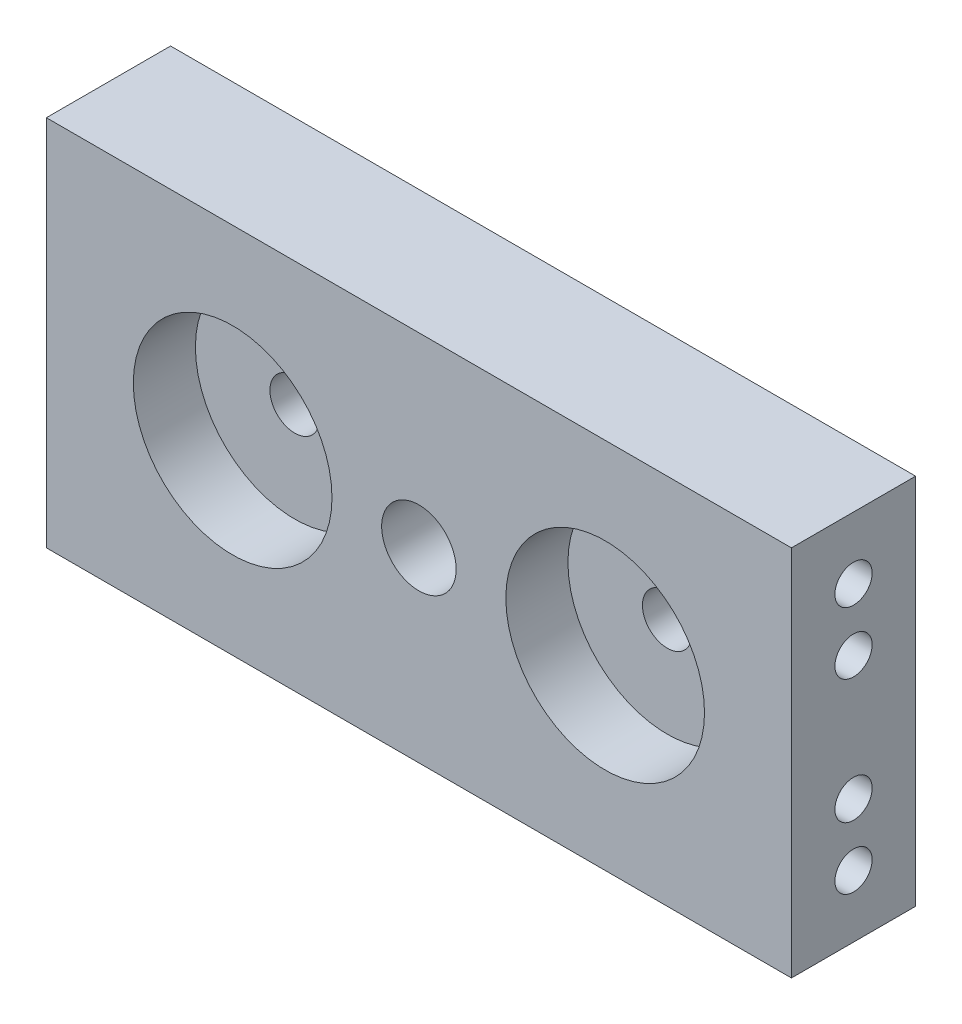
ISO-10303-21;
HEADER;
FILE_DESCRIPTION(('STEP AP214'),'2;1');
FILE_NAME('part.step','',(''),(''),'','','');
FILE_SCHEMA(('AUTOMOTIVE_DESIGN { 1 0 10303 214 1 1 1 1 }'));
ENDSEC;
DATA;
#1=APPLICATION_CONTEXT('core data for automotive mechanical design processes');
#2=APPLICATION_PROTOCOL_DEFINITION('international standard','automotive_design',2000,#1);
#3=PRODUCT_CONTEXT('',#1,'mechanical');
#4=PRODUCT('Part','Part','',(#3));
#5=PRODUCT_RELATED_PRODUCT_CATEGORY('part','',(#4));
#6=PRODUCT_DEFINITION_FORMATION('','',#4);
#7=PRODUCT_DEFINITION_CONTEXT('part definition',#1,'design');
#8=PRODUCT_DEFINITION('design','',#6,#7);
#9=PRODUCT_DEFINITION_SHAPE('','',#8);
#10=(LENGTH_UNIT() NAMED_UNIT(*) SI_UNIT(.MILLI.,.METRE.));
#11=(NAMED_UNIT(*) PLANE_ANGLE_UNIT() SI_UNIT($,.RADIAN.));
#12=(NAMED_UNIT(*) SI_UNIT($,.STERADIAN.) SOLID_ANGLE_UNIT());
#13=UNCERTAINTY_MEASURE_WITH_UNIT(LENGTH_MEASURE(1.E-05),#10,'distance_accuracy_value','');
#14=(GEOMETRIC_REPRESENTATION_CONTEXT(3) GLOBAL_UNCERTAINTY_ASSIGNED_CONTEXT((#13)) GLOBAL_UNIT_ASSIGNED_CONTEXT((#10,
#11,#12)) REPRESENTATION_CONTEXT('',''));
#15=CARTESIAN_POINT('',(0.,0.,0.));
#16=DIRECTION('',(0.,0.,1.));
#17=DIRECTION('',(1.,0.,0.));
#18=AXIS2_PLACEMENT_3D('',#15,#16,#17);
#19=CARTESIAN_POINT('',(30.,-30.,0.));
#20=DIRECTION('',(0.,0.,1.));
#21=DIRECTION('',(1.,0.,0.));
#22=AXIS2_PLACEMENT_3D('',#19,#20,#21);
#23=CYLINDRICAL_SURFACE('',#22,4.00000000000001);
#24=CARTESIAN_POINT('',(30.,-30.,0.));
#25=DIRECTION('',(0.,0.,1.));
#26=DIRECTION('',(1.,0.,0.));
#27=AXIS2_PLACEMENT_3D('',#24,#25,#26);
#28=CIRCLE('',#27,4.00000000000001);
#29=CARTESIAN_POINT('',(34.,-30.,0.));
#30=VERTEX_POINT('',#29);
#31=EDGE_CURVE('E145',#30,#30,#28,.T.);
#32=ORIENTED_EDGE('',*,*,#31,.F.);
#33=EDGE_LOOP('',(#32));
#34=FACE_BOUND('',#33,.T.);
#35=CARTESIAN_POINT('',(30.,-30.,10.));
#36=DIRECTION('',(0.,0.,1.));
#37=DIRECTION('',(1.,0.,0.));
#38=AXIS2_PLACEMENT_3D('',#35,#36,#37);
#39=CIRCLE('',#38,4.00000000000001);
#40=CARTESIAN_POINT('',(34.,-30.,10.));
#41=VERTEX_POINT('',#40);
#42=EDGE_CURVE('E165',#41,#41,#39,.F.);
#43=ORIENTED_EDGE('',*,*,#42,.F.);
#44=EDGE_LOOP('',(#43));
#45=FACE_BOUND('',#44,.T.);
#46=ADVANCED_FACE('F47',(#34,#45),#23,.F.);
#47=CARTESIAN_POINT('',(90.,-30.,0.));
#48=DIRECTION('',(0.,0.,1.));
#49=DIRECTION('',(1.,0.,0.));
#50=AXIS2_PLACEMENT_3D('',#47,#48,#49);
#51=CYLINDRICAL_SURFACE('',#50,4.00000000000001);
#52=CARTESIAN_POINT('',(90.,-30.,0.));
#53=DIRECTION('',(0.,0.,1.));
#54=DIRECTION('',(1.,0.,0.));
#55=AXIS2_PLACEMENT_3D('',#52,#53,#54);
#56=CIRCLE('',#55,4.00000000000001);
#57=CARTESIAN_POINT('',(94.,-30.,0.));
#58=VERTEX_POINT('',#57);
#59=EDGE_CURVE('E121',#58,#58,#56,.T.);
#60=ORIENTED_EDGE('',*,*,#59,.F.);
#61=EDGE_LOOP('',(#60));
#62=FACE_BOUND('',#61,.T.);
#63=CARTESIAN_POINT('',(90.,-30.,10.));
#64=DIRECTION('',(0.,0.,1.));
#65=DIRECTION('',(1.,0.,0.));
#66=AXIS2_PLACEMENT_3D('',#63,#64,#65);
#67=CIRCLE('',#66,4.00000000000001);
#68=CARTESIAN_POINT('',(94.,-30.,10.));
#69=VERTEX_POINT('',#68);
#70=EDGE_CURVE('E51',#69,#69,#67,.F.);
#71=ORIENTED_EDGE('',*,*,#70,.F.);
#72=EDGE_LOOP('',(#71));
#73=FACE_BOUND('',#72,.T.);
#74=ADVANCED_FACE('F275',(#62,#73),#51,.F.);
#75=CARTESIAN_POINT('',(0.,-60.,20.));
#76=DIRECTION('',(0.,-1.,0.));
#77=DIRECTION('',(1.,0.,0.));
#78=AXIS2_PLACEMENT_3D('',#75,#76,#77);
#79=PLANE('',#78);
#80=DIRECTION('',(-1.,0.,0.));
#81=VECTOR('',#80,1.);
#82=CARTESIAN_POINT('',(0.,-60.,0.));
#83=LINE('',#82,#81);
#84=CARTESIAN_POINT('',(120.,-60.,0.));
#85=VERTEX_POINT('',#84);
#86=CARTESIAN_POINT('',(0.,-60.,0.));
#87=VERTEX_POINT('',#86);
#88=EDGE_CURVE('E118',#85,#87,#83,.T.);
#89=ORIENTED_EDGE('',*,*,#88,.F.);
#90=DIRECTION('',(0.,0.,-1.));
#91=VECTOR('',#90,1.);
#92=CARTESIAN_POINT('',(120.,-60.,20.));
#93=LINE('',#92,#91);
#94=CARTESIAN_POINT('',(120.,-60.,20.));
#95=VERTEX_POINT('',#94);
#96=EDGE_CURVE('E12',#95,#85,#93,.T.);
#97=ORIENTED_EDGE('',*,*,#96,.F.);
#98=DIRECTION('',(-1.,0.,0.));
#99=VECTOR('',#98,1.);
#100=CARTESIAN_POINT('',(0.,-60.,20.));
#101=LINE('',#100,#99);
#102=CARTESIAN_POINT('',(0.,-60.,20.));
#103=VERTEX_POINT('',#102);
#104=EDGE_CURVE('E107',#95,#103,#101,.T.);
#105=ORIENTED_EDGE('',*,*,#104,.T.);
#106=DIRECTION('',(0.,0.,-1.));
#107=VECTOR('',#106,1.);
#108=CARTESIAN_POINT('',(0.,-60.,20.));
#109=LINE('',#108,#107);
#110=EDGE_CURVE('E66',#103,#87,#109,.T.);
#111=ORIENTED_EDGE('',*,*,#110,.T.);
#112=EDGE_LOOP('',(#89,#97,#105,#111));
#113=FACE_BOUND('',#112,.T.);
#114=ADVANCED_FACE('F49',(#113),#79,.T.);
#115=CARTESIAN_POINT('',(120.,0.,20.));
#116=DIRECTION('',(1.,0.,0.));
#117=DIRECTION('',(0.,1.,0.));
#118=AXIS2_PLACEMENT_3D('',#115,#116,#117);
#119=PLANE('',#118);
#120=CARTESIAN_POINT('',(120.,-9.99999999999999,10.));
#121=DIRECTION('',(1.,0.,0.));
#122=DIRECTION('',(0.,1.,0.));
#123=AXIS2_PLACEMENT_3D('',#120,#121,#122);
#124=CIRCLE('',#123,3.);
#125=CARTESIAN_POINT('',(120.,-6.99999999999999,10.));
#126=VERTEX_POINT('',#125);
#127=EDGE_CURVE('E198',#126,#126,#124,.T.);
#128=ORIENTED_EDGE('',*,*,#127,.F.);
#129=EDGE_LOOP('',(#128));
#130=FACE_BOUND('',#129,.T.);
#131=CARTESIAN_POINT('',(120.,-20.,10.));
#132=DIRECTION('',(1.,0.,0.));
#133=DIRECTION('',(0.,1.,0.));
#134=AXIS2_PLACEMENT_3D('',#131,#132,#133);
#135=CIRCLE('',#134,3.);
#136=CARTESIAN_POINT('',(120.,-17.,10.));
#137=VERTEX_POINT('',#136);
#138=EDGE_CURVE('E194',#137,#137,#135,.T.);
#139=ORIENTED_EDGE('',*,*,#138,.F.);
#140=EDGE_LOOP('',(#139));
#141=FACE_BOUND('',#140,.T.);
#142=CARTESIAN_POINT('',(120.,-40.,10.));
#143=DIRECTION('',(1.,0.,0.));
#144=DIRECTION('',(0.,1.,0.));
#145=AXIS2_PLACEMENT_3D('',#142,#143,#144);
#146=CIRCLE('',#145,3.);
#147=CARTESIAN_POINT('',(120.,-37.,10.));
#148=VERTEX_POINT('',#147);
#149=EDGE_CURVE('E186',#148,#148,#146,.T.);
#150=ORIENTED_EDGE('',*,*,#149,.F.);
#151=EDGE_LOOP('',(#150));
#152=FACE_BOUND('',#151,.T.);
#153=CARTESIAN_POINT('',(120.,-50.,10.));
#154=DIRECTION('',(1.,0.,0.));
#155=DIRECTION('',(0.,1.,0.));
#156=AXIS2_PLACEMENT_3D('',#153,#154,#155);
#157=CIRCLE('',#156,3.);
#158=CARTESIAN_POINT('',(120.,-47.,10.));
#159=VERTEX_POINT('',#158);
#160=EDGE_CURVE('E177',#159,#159,#157,.T.);
#161=ORIENTED_EDGE('',*,*,#160,.F.);
#162=EDGE_LOOP('',(#161));
#163=FACE_BOUND('',#162,.T.);
#164=DIRECTION('',(0.,-1.,0.));
#165=VECTOR('',#164,1.);
#166=CARTESIAN_POINT('',(120.,0.,0.));
#167=LINE('',#166,#165);
#168=CARTESIAN_POINT('',(120.,0.,0.));
#169=VERTEX_POINT('',#168);
#170=EDGE_CURVE('E96',#169,#85,#167,.T.);
#171=ORIENTED_EDGE('',*,*,#170,.F.);
#172=DIRECTION('',(0.,0.,-1.));
#173=VECTOR('',#172,1.);
#174=CARTESIAN_POINT('',(120.,0.,20.));
#175=LINE('',#174,#173);
#176=CARTESIAN_POINT('',(120.,0.,20.));
#177=VERTEX_POINT('',#176);
#178=EDGE_CURVE('E58',#177,#169,#175,.T.);
#179=ORIENTED_EDGE('',*,*,#178,.F.);
#180=DIRECTION('',(0.,-1.,0.));
#181=VECTOR('',#180,1.);
#182=CARTESIAN_POINT('',(120.,0.,20.));
#183=LINE('',#182,#181);
#184=EDGE_CURVE('E94',#177,#95,#183,.T.);
#185=ORIENTED_EDGE('',*,*,#184,.T.);
#186=ORIENTED_EDGE('',*,*,#96,.T.);
#187=EDGE_LOOP('',(#171,#179,#185,#186));
#188=FACE_BOUND('',#187,.T.);
#189=ADVANCED_FACE('F93',(#130,#141,#152,#163,#188),#119,.T.);
#190=CARTESIAN_POINT('',(0.,0.,20.));
#191=DIRECTION('',(0.,1.,0.));
#192=DIRECTION('',(0.,0.,1.));
#193=AXIS2_PLACEMENT_3D('',#190,#191,#192);
#194=PLANE('',#193);
#195=DIRECTION('',(1.,0.,0.));
#196=VECTOR('',#195,1.);
#197=CARTESIAN_POINT('',(0.,0.,0.));
#198=LINE('',#197,#196);
#199=CARTESIAN_POINT('',(0.,0.,0.));
#200=VERTEX_POINT('',#199);
#201=EDGE_CURVE('E124',#200,#169,#198,.T.);
#202=ORIENTED_EDGE('',*,*,#201,.F.);
#203=DIRECTION('',(0.,0.,-1.));
#204=VECTOR('',#203,1.);
#205=CARTESIAN_POINT('',(0.,0.,20.));
#206=LINE('',#205,#204);
#207=CARTESIAN_POINT('',(0.,0.,20.));
#208=VERTEX_POINT('',#207);
#209=EDGE_CURVE('E79',#208,#200,#206,.T.);
#210=ORIENTED_EDGE('',*,*,#209,.F.);
#211=DIRECTION('',(1.,0.,0.));
#212=VECTOR('',#211,1.);
#213=CARTESIAN_POINT('',(0.,0.,20.));
#214=LINE('',#213,#212);
#215=EDGE_CURVE('E106',#208,#177,#214,.T.);
#216=ORIENTED_EDGE('',*,*,#215,.T.);
#217=ORIENTED_EDGE('',*,*,#178,.T.);
#218=EDGE_LOOP('',(#202,#210,#216,#217));
#219=FACE_BOUND('',#218,.T.);
#220=ADVANCED_FACE('F110',(#219),#194,.T.);
#221=CARTESIAN_POINT('',(0.,0.,20.));
#222=DIRECTION('',(-1.,0.,0.));
#223=DIRECTION('',(0.,-1.,0.));
#224=AXIS2_PLACEMENT_3D('',#221,#222,#223);
#225=PLANE('',#224);
#226=CARTESIAN_POINT('',(0.,-10.,10.));
#227=DIRECTION('',(-1.,0.,0.));
#228=DIRECTION('',(0.,-1.,0.));
#229=AXIS2_PLACEMENT_3D('',#226,#227,#228);
#230=CIRCLE('',#229,3.);
#231=CARTESIAN_POINT('',(0.,-13.,10.));
#232=VERTEX_POINT('',#231);
#233=EDGE_CURVE('E229',#232,#232,#230,.T.);
#234=ORIENTED_EDGE('',*,*,#233,.F.);
#235=EDGE_LOOP('',(#234));
#236=FACE_BOUND('',#235,.T.);
#237=CARTESIAN_POINT('',(0.,-20.,10.));
#238=DIRECTION('',(-1.,0.,0.));
#239=DIRECTION('',(0.,-1.,0.));
#240=AXIS2_PLACEMENT_3D('',#237,#238,#239);
#241=CIRCLE('',#240,3.);
#242=CARTESIAN_POINT('',(0.,-23.,10.));
#243=VERTEX_POINT('',#242);
#244=EDGE_CURVE('E225',#243,#243,#241,.T.);
#245=ORIENTED_EDGE('',*,*,#244,.F.);
#246=EDGE_LOOP('',(#245));
#247=FACE_BOUND('',#246,.T.);
#248=CARTESIAN_POINT('',(0.,-40.,10.));
#249=DIRECTION('',(-1.,0.,0.));
#250=DIRECTION('',(0.,-1.,0.));
#251=AXIS2_PLACEMENT_3D('',#248,#249,#250);
#252=CIRCLE('',#251,3.);
#253=CARTESIAN_POINT('',(0.,-43.,10.));
#254=VERTEX_POINT('',#253);
#255=EDGE_CURVE('E217',#254,#254,#252,.T.);
#256=ORIENTED_EDGE('',*,*,#255,.F.);
#257=EDGE_LOOP('',(#256));
#258=FACE_BOUND('',#257,.T.);
#259=CARTESIAN_POINT('',(0.,-50.,10.));
#260=DIRECTION('',(-1.,0.,0.));
#261=DIRECTION('',(0.,-1.,0.));
#262=AXIS2_PLACEMENT_3D('',#259,#260,#261);
#263=CIRCLE('',#262,3.);
#264=CARTESIAN_POINT('',(0.,-53.,10.));
#265=VERTEX_POINT('',#264);
#266=EDGE_CURVE('E209',#265,#265,#263,.T.);
#267=ORIENTED_EDGE('',*,*,#266,.F.);
#268=EDGE_LOOP('',(#267));
#269=FACE_BOUND('',#268,.T.);
#270=DIRECTION('',(0.,1.,0.));
#271=VECTOR('',#270,1.);
#272=CARTESIAN_POINT('',(0.,0.,0.));
#273=LINE('',#272,#271);
#274=EDGE_CURVE('E127',#87,#200,#273,.T.);
#275=ORIENTED_EDGE('',*,*,#274,.F.);
#276=ORIENTED_EDGE('',*,*,#110,.F.);
#277=DIRECTION('',(0.,1.,0.));
#278=VECTOR('',#277,1.);
#279=CARTESIAN_POINT('',(0.,0.,20.));
#280=LINE('',#279,#278);
#281=EDGE_CURVE('E112',#103,#208,#280,.T.);
#282=ORIENTED_EDGE('',*,*,#281,.T.);
#283=ORIENTED_EDGE('',*,*,#209,.T.);
#284=EDGE_LOOP('',(#275,#276,#282,#283));
#285=FACE_BOUND('',#284,.T.);
#286=ADVANCED_FACE('F246',(#236,#247,#258,#269,#285),#225,.T.);
#287=CARTESIAN_POINT('',(0.,0.,20.));
#288=DIRECTION('',(0.,0.,1.));
#289=DIRECTION('',(1.,0.,0.));
#290=AXIS2_PLACEMENT_3D('',#287,#288,#289);
#291=PLANE('',#290);
#292=CARTESIAN_POINT('',(30.,-30.,20.));
#293=DIRECTION('',(0.,0.,1.));
#294=DIRECTION('',(1.,0.,0.));
#295=AXIS2_PLACEMENT_3D('',#292,#293,#294);
#296=CIRCLE('',#295,16.);
#297=CARTESIAN_POINT('',(46.,-30.,20.));
#298=VERTEX_POINT('',#297);
#299=EDGE_CURVE('E161',#298,#298,#296,.T.);
#300=ORIENTED_EDGE('',*,*,#299,.F.);
#301=EDGE_LOOP('',(#300));
#302=FACE_BOUND('',#301,.T.);
#303=CARTESIAN_POINT('',(90.,-30.,20.));
#304=DIRECTION('',(0.,0.,1.));
#305=DIRECTION('',(1.,0.,0.));
#306=AXIS2_PLACEMENT_3D('',#303,#304,#305);
#307=CIRCLE('',#306,16.);
#308=CARTESIAN_POINT('',(106.,-30.,20.));
#309=VERTEX_POINT('',#308);
#310=EDGE_CURVE('E156',#309,#309,#307,.T.);
#311=ORIENTED_EDGE('',*,*,#310,.F.);
#312=EDGE_LOOP('',(#311));
#313=FACE_BOUND('',#312,.T.);
#314=CARTESIAN_POINT('',(60.,-30.,20.));
#315=DIRECTION('',(0.,0.,1.));
#316=DIRECTION('',(1.,0.,0.));
#317=AXIS2_PLACEMENT_3D('',#314,#315,#316);
#318=CIRCLE('',#317,6.);
#319=CARTESIAN_POINT('',(66.,-30.,20.));
#320=VERTEX_POINT('',#319);
#321=EDGE_CURVE('E141',#320,#320,#318,.T.);
#322=ORIENTED_EDGE('',*,*,#321,.F.);
#323=EDGE_LOOP('',(#322));
#324=FACE_BOUND('',#323,.T.);
#325=ORIENTED_EDGE('',*,*,#104,.F.);
#326=ORIENTED_EDGE('',*,*,#184,.F.);
#327=ORIENTED_EDGE('',*,*,#215,.F.);
#328=ORIENTED_EDGE('',*,*,#281,.F.);
#329=EDGE_LOOP('',(#325,#326,#327,#328));
#330=FACE_BOUND('',#329,.T.);
#331=ADVANCED_FACE('F104',(#302,#313,#324,#330),#291,.T.);
#332=CARTESIAN_POINT('',(0.,0.,0.));
#333=DIRECTION('',(0.,0.,1.));
#334=DIRECTION('',(1.,0.,0.));
#335=AXIS2_PLACEMENT_3D('',#332,#333,#334);
#336=PLANE('',#335);
#337=ORIENTED_EDGE('',*,*,#59,.T.);
#338=EDGE_LOOP('',(#337));
#339=FACE_BOUND('',#338,.T.);
#340=ORIENTED_EDGE('',*,*,#31,.T.);
#341=EDGE_LOOP('',(#340));
#342=FACE_BOUND('',#341,.T.);
#343=CARTESIAN_POINT('',(60.,-30.,0.));
#344=DIRECTION('',(0.,0.,1.));
#345=DIRECTION('',(1.,0.,0.));
#346=AXIS2_PLACEMENT_3D('',#343,#344,#345);
#347=CIRCLE('',#346,6.);
#348=CARTESIAN_POINT('',(66.,-30.,0.));
#349=VERTEX_POINT('',#348);
#350=EDGE_CURVE('E137',#349,#349,#347,.T.);
#351=ORIENTED_EDGE('',*,*,#350,.T.);
#352=EDGE_LOOP('',(#351));
#353=FACE_BOUND('',#352,.T.);
#354=ORIENTED_EDGE('',*,*,#88,.T.);
#355=ORIENTED_EDGE('',*,*,#274,.T.);
#356=ORIENTED_EDGE('',*,*,#201,.T.);
#357=ORIENTED_EDGE('',*,*,#170,.T.);
#358=EDGE_LOOP('',(#354,#355,#356,#357));
#359=FACE_BOUND('',#358,.T.);
#360=ADVANCED_FACE('F291',(#339,#342,#353,#359),#336,.F.);
#361=CARTESIAN_POINT('',(60.,-30.,0.));
#362=DIRECTION('',(0.,0.,1.));
#363=DIRECTION('',(1.,0.,0.));
#364=AXIS2_PLACEMENT_3D('',#361,#362,#363);
#365=CYLINDRICAL_SURFACE('',#364,6.);
#366=ORIENTED_EDGE('',*,*,#350,.F.);
#367=EDGE_LOOP('',(#366));
#368=FACE_BOUND('',#367,.T.);
#369=ORIENTED_EDGE('',*,*,#321,.T.);
#370=EDGE_LOOP('',(#369));
#371=FACE_BOUND('',#370,.T.);
#372=ADVANCED_FACE('F287',(#368,#371),#365,.F.);
#373=CARTESIAN_POINT('',(0.,0.,10.));
#374=DIRECTION('',(0.,0.,1.));
#375=DIRECTION('',(1.,0.,0.));
#376=AXIS2_PLACEMENT_3D('',#373,#374,#375);
#377=PLANE('',#376);
#378=CARTESIAN_POINT('',(90.,-30.,10.));
#379=DIRECTION('',(0.,0.,1.));
#380=DIRECTION('',(1.,0.,0.));
#381=AXIS2_PLACEMENT_3D('',#378,#379,#380);
#382=CIRCLE('',#381,16.);
#383=CARTESIAN_POINT('',(106.,-30.,10.));
#384=VERTEX_POINT('',#383);
#385=EDGE_CURVE('E152',#384,#384,#382,.T.);
#386=ORIENTED_EDGE('',*,*,#385,.T.);
#387=EDGE_LOOP('',(#386));
#388=FACE_BOUND('',#387,.T.);
#389=ORIENTED_EDGE('',*,*,#70,.T.);
#390=EDGE_LOOP('',(#389));
#391=FACE_BOUND('',#390,.T.);
#392=ADVANCED_FACE('F290',(#388,#391),#377,.T.);
#393=CARTESIAN_POINT('',(90.,-30.,10.));
#394=DIRECTION('',(0.,0.,1.));
#395=DIRECTION('',(1.,0.,0.));
#396=AXIS2_PLACEMENT_3D('',#393,#394,#395);
#397=CYLINDRICAL_SURFACE('',#396,16.);
#398=ORIENTED_EDGE('',*,*,#385,.F.);
#399=EDGE_LOOP('',(#398));
#400=FACE_BOUND('',#399,.T.);
#401=ORIENTED_EDGE('',*,*,#310,.T.);
#402=EDGE_LOOP('',(#401));
#403=FACE_BOUND('',#402,.T.);
#404=ADVANCED_FACE('F336',(#400,#403),#397,.F.);
#405=CARTESIAN_POINT('',(30.,-30.,10.));
#406=DIRECTION('',(0.,0.,1.));
#407=DIRECTION('',(1.,0.,0.));
#408=AXIS2_PLACEMENT_3D('',#405,#406,#407);
#409=CYLINDRICAL_SURFACE('',#408,16.);
#410=CARTESIAN_POINT('',(30.,-30.,10.));
#411=DIRECTION('',(0.,0.,1.));
#412=DIRECTION('',(1.,0.,0.));
#413=AXIS2_PLACEMENT_3D('',#410,#411,#412);
#414=CIRCLE('',#413,16.);
#415=CARTESIAN_POINT('',(46.,-30.,10.));
#416=VERTEX_POINT('',#415);
#417=EDGE_CURVE('E166',#416,#416,#414,.T.);
#418=ORIENTED_EDGE('',*,*,#417,.F.);
#419=EDGE_LOOP('',(#418));
#420=FACE_BOUND('',#419,.T.);
#421=ORIENTED_EDGE('',*,*,#299,.T.);
#422=EDGE_LOOP('',(#421));
#423=FACE_BOUND('',#422,.T.);
#424=ADVANCED_FACE('F326',(#420,#423),#409,.F.);
#425=CARTESIAN_POINT('',(0.,0.,10.));
#426=DIRECTION('',(0.,0.,1.));
#427=DIRECTION('',(1.,0.,0.));
#428=AXIS2_PLACEMENT_3D('',#425,#426,#427);
#429=PLANE('',#428);
#430=ORIENTED_EDGE('',*,*,#42,.T.);
#431=EDGE_LOOP('',(#430));
#432=FACE_BOUND('',#431,.T.);
#433=ORIENTED_EDGE('',*,*,#417,.T.);
#434=EDGE_LOOP('',(#433));
#435=FACE_BOUND('',#434,.T.);
#436=ADVANCED_FACE('F316',(#432,#435),#429,.T.);
#437=CARTESIAN_POINT('',(110.,-50.,10.));
#438=DIRECTION('',(1.,0.,0.));
#439=DIRECTION('',(0.,1.,0.));
#440=AXIS2_PLACEMENT_3D('',#437,#438,#439);
#441=CYLINDRICAL_SURFACE('',#440,3.);
#442=CARTESIAN_POINT('',(110.,-50.,10.));
#443=DIRECTION('',(1.,0.,0.));
#444=DIRECTION('',(0.,1.,0.));
#445=AXIS2_PLACEMENT_3D('',#442,#443,#444);
#446=CIRCLE('',#445,3.);
#447=CARTESIAN_POINT('',(110.,-47.,10.));
#448=VERTEX_POINT('',#447);
#449=EDGE_CURVE('E173',#448,#448,#446,.T.);
#450=ORIENTED_EDGE('',*,*,#449,.F.);
#451=EDGE_LOOP('',(#450));
#452=FACE_BOUND('',#451,.T.);
#453=ORIENTED_EDGE('',*,*,#160,.T.);
#454=EDGE_LOOP('',(#453));
#455=FACE_BOUND('',#454,.T.);
#456=ADVANCED_FACE('F313',(#452,#455),#441,.F.);
#457=CARTESIAN_POINT('',(110.,-50.,10.));
#458=DIRECTION('',(1.,0.,0.));
#459=DIRECTION('',(0.,1.,0.));
#460=AXIS2_PLACEMENT_3D('',#457,#458,#459);
#461=PLANE('',#460);
#462=ORIENTED_EDGE('',*,*,#449,.T.);
#463=EDGE_LOOP('',(#462));
#464=FACE_BOUND('',#463,.T.);
#465=ADVANCED_FACE('F315',(#464),#461,.T.);
#466=CARTESIAN_POINT('',(110.,-40.,10.));
#467=DIRECTION('',(1.,0.,0.));
#468=DIRECTION('',(0.,1.,0.));
#469=AXIS2_PLACEMENT_3D('',#466,#467,#468);
#470=CYLINDRICAL_SURFACE('',#469,3.);
#471=CARTESIAN_POINT('',(110.,-40.,10.));
#472=DIRECTION('',(1.,0.,0.));
#473=DIRECTION('',(0.,1.,0.));
#474=AXIS2_PLACEMENT_3D('',#471,#472,#473);
#475=CIRCLE('',#474,3.);
#476=CARTESIAN_POINT('',(110.,-37.,10.));
#477=VERTEX_POINT('',#476);
#478=EDGE_CURVE('E182',#477,#477,#475,.T.);
#479=ORIENTED_EDGE('',*,*,#478,.F.);
#480=EDGE_LOOP('',(#479));
#481=FACE_BOUND('',#480,.T.);
#482=ORIENTED_EDGE('',*,*,#149,.T.);
#483=EDGE_LOOP('',(#482));
#484=FACE_BOUND('',#483,.T.);
#485=ADVANCED_FACE('F323',(#481,#484),#470,.F.);
#486=CARTESIAN_POINT('',(110.,-40.,10.));
#487=DIRECTION('',(1.,0.,0.));
#488=DIRECTION('',(0.,1.,0.));
#489=AXIS2_PLACEMENT_3D('',#486,#487,#488);
#490=PLANE('',#489);
#491=ORIENTED_EDGE('',*,*,#478,.T.);
#492=EDGE_LOOP('',(#491));
#493=FACE_BOUND('',#492,.T.);
#494=ADVANCED_FACE('F331',(#493),#490,.T.);
#495=CARTESIAN_POINT('',(110.,-20.,10.));
#496=DIRECTION('',(1.,0.,0.));
#497=DIRECTION('',(0.,1.,0.));
#498=AXIS2_PLACEMENT_3D('',#495,#496,#497);
#499=CYLINDRICAL_SURFACE('',#498,3.);
#500=CARTESIAN_POINT('',(110.,-20.,10.));
#501=DIRECTION('',(1.,0.,0.));
#502=DIRECTION('',(0.,1.,0.));
#503=AXIS2_PLACEMENT_3D('',#500,#501,#502);
#504=CIRCLE('',#503,3.);
#505=CARTESIAN_POINT('',(110.,-17.,10.));
#506=VERTEX_POINT('',#505);
#507=EDGE_CURVE('E190',#506,#506,#504,.T.);
#508=ORIENTED_EDGE('',*,*,#507,.F.);
#509=EDGE_LOOP('',(#508));
#510=FACE_BOUND('',#509,.T.);
#511=ORIENTED_EDGE('',*,*,#138,.T.);
#512=EDGE_LOOP('',(#511));
#513=FACE_BOUND('',#512,.T.);
#514=ADVANCED_FACE('F404',(#510,#513),#499,.F.);
#515=CARTESIAN_POINT('',(110.,-20.,10.));
#516=DIRECTION('',(1.,0.,0.));
#517=DIRECTION('',(0.,1.,0.));
#518=AXIS2_PLACEMENT_3D('',#515,#516,#517);
#519=PLANE('',#518);
#520=ORIENTED_EDGE('',*,*,#507,.T.);
#521=EDGE_LOOP('',(#520));
#522=FACE_BOUND('',#521,.T.);
#523=ADVANCED_FACE('F413',(#522),#519,.T.);
#524=CARTESIAN_POINT('',(110.,-9.99999999999999,10.));
#525=DIRECTION('',(1.,0.,0.));
#526=DIRECTION('',(0.,1.,0.));
#527=AXIS2_PLACEMENT_3D('',#524,#525,#526);
#528=CYLINDRICAL_SURFACE('',#527,3.);
#529=CARTESIAN_POINT('',(110.,-9.99999999999999,10.));
#530=DIRECTION('',(1.,0.,0.));
#531=DIRECTION('',(0.,1.,0.));
#532=AXIS2_PLACEMENT_3D('',#529,#530,#531);
#533=CIRCLE('',#532,3.);
#534=CARTESIAN_POINT('',(110.,-6.99999999999999,10.));
#535=VERTEX_POINT('',#534);
#536=EDGE_CURVE('E157',#535,#535,#533,.T.);
#537=ORIENTED_EDGE('',*,*,#536,.F.);
#538=EDGE_LOOP('',(#537));
#539=FACE_BOUND('',#538,.T.);
#540=ORIENTED_EDGE('',*,*,#127,.T.);
#541=EDGE_LOOP('',(#540));
#542=FACE_BOUND('',#541,.T.);
#543=ADVANCED_FACE('F269',(#539,#542),#528,.F.);
#544=CARTESIAN_POINT('',(110.,-9.99999999999999,10.));
#545=DIRECTION('',(1.,0.,0.));
#546=DIRECTION('',(0.,1.,0.));
#547=AXIS2_PLACEMENT_3D('',#544,#545,#546);
#548=PLANE('',#547);
#549=ORIENTED_EDGE('',*,*,#536,.T.);
#550=EDGE_LOOP('',(#549));
#551=FACE_BOUND('',#550,.T.);
#552=ADVANCED_FACE('F259',(#551),#548,.T.);
#553=CARTESIAN_POINT('',(10.,-50.,10.));
#554=DIRECTION('',(-1.,0.,0.));
#555=DIRECTION('',(0.,-1.,0.));
#556=AXIS2_PLACEMENT_3D('',#553,#554,#555);
#557=CYLINDRICAL_SURFACE('',#556,3.);
#558=CARTESIAN_POINT('',(10.,-50.,10.));
#559=DIRECTION('',(-1.,0.,0.));
#560=DIRECTION('',(0.,-1.,0.));
#561=AXIS2_PLACEMENT_3D('',#558,#559,#560);
#562=CIRCLE('',#561,3.);
#563=CARTESIAN_POINT('',(10.,-53.,10.));
#564=VERTEX_POINT('',#563);
#565=EDGE_CURVE('E205',#564,#564,#562,.T.);
#566=ORIENTED_EDGE('',*,*,#565,.F.);
#567=EDGE_LOOP('',(#566));
#568=FACE_BOUND('',#567,.T.);
#569=ORIENTED_EDGE('',*,*,#266,.T.);
#570=EDGE_LOOP('',(#569));
#571=FACE_BOUND('',#570,.T.);
#572=ADVANCED_FACE('F256',(#568,#571),#557,.F.);
#573=CARTESIAN_POINT('',(10.,-50.,10.));
#574=DIRECTION('',(-1.,0.,0.));
#575=DIRECTION('',(0.,-1.,0.));
#576=AXIS2_PLACEMENT_3D('',#573,#574,#575);
#577=PLANE('',#576);
#578=ORIENTED_EDGE('',*,*,#565,.T.);
#579=EDGE_LOOP('',(#578));
#580=FACE_BOUND('',#579,.T.);
#581=ADVANCED_FACE('F258',(#580),#577,.T.);
#582=CARTESIAN_POINT('',(10.,-40.,10.));
#583=DIRECTION('',(-1.,0.,0.));
#584=DIRECTION('',(0.,-1.,0.));
#585=AXIS2_PLACEMENT_3D('',#582,#583,#584);
#586=CYLINDRICAL_SURFACE('',#585,3.);
#587=CARTESIAN_POINT('',(10.,-40.,10.));
#588=DIRECTION('',(-1.,0.,0.));
#589=DIRECTION('',(0.,-1.,0.));
#590=AXIS2_PLACEMENT_3D('',#587,#588,#589);
#591=CIRCLE('',#590,3.);
#592=CARTESIAN_POINT('',(10.,-43.,10.));
#593=VERTEX_POINT('',#592);
#594=EDGE_CURVE('E213',#593,#593,#591,.T.);
#595=ORIENTED_EDGE('',*,*,#594,.F.);
#596=EDGE_LOOP('',(#595));
#597=FACE_BOUND('',#596,.T.);
#598=ORIENTED_EDGE('',*,*,#255,.T.);
#599=EDGE_LOOP('',(#598));
#600=FACE_BOUND('',#599,.T.);
#601=ADVANCED_FACE('F266',(#597,#600),#586,.F.);
#602=CARTESIAN_POINT('',(10.,-40.,10.));
#603=DIRECTION('',(-1.,0.,0.));
#604=DIRECTION('',(0.,-1.,0.));
#605=AXIS2_PLACEMENT_3D('',#602,#603,#604);
#606=PLANE('',#605);
#607=ORIENTED_EDGE('',*,*,#594,.T.);
#608=EDGE_LOOP('',(#607));
#609=FACE_BOUND('',#608,.T.);
#610=ADVANCED_FACE('F464',(#609),#606,.T.);
#611=CARTESIAN_POINT('',(10.,-20.,10.));
#612=DIRECTION('',(-1.,0.,0.));
#613=DIRECTION('',(0.,-1.,0.));
#614=AXIS2_PLACEMENT_3D('',#611,#612,#613);
#615=CYLINDRICAL_SURFACE('',#614,3.);
#616=CARTESIAN_POINT('',(10.,-20.,10.));
#617=DIRECTION('',(-1.,0.,0.));
#618=DIRECTION('',(0.,-1.,0.));
#619=AXIS2_PLACEMENT_3D('',#616,#617,#618);
#620=CIRCLE('',#619,3.);
#621=CARTESIAN_POINT('',(10.,-23.,10.));
#622=VERTEX_POINT('',#621);
#623=EDGE_CURVE('E221',#622,#622,#620,.T.);
#624=ORIENTED_EDGE('',*,*,#623,.F.);
#625=EDGE_LOOP('',(#624));
#626=FACE_BOUND('',#625,.T.);
#627=ORIENTED_EDGE('',*,*,#244,.T.);
#628=EDGE_LOOP('',(#627));
#629=FACE_BOUND('',#628,.T.);
#630=ADVANCED_FACE('F474',(#626,#629),#615,.F.);
#631=CARTESIAN_POINT('',(10.,-20.,10.));
#632=DIRECTION('',(-1.,0.,0.));
#633=DIRECTION('',(0.,-1.,0.));
#634=AXIS2_PLACEMENT_3D('',#631,#632,#633);
#635=PLANE('',#634);
#636=ORIENTED_EDGE('',*,*,#623,.T.);
#637=EDGE_LOOP('',(#636));
#638=FACE_BOUND('',#637,.T.);
#639=ADVANCED_FACE('F242',(#638),#635,.T.);
#640=CARTESIAN_POINT('',(10.,-10.,10.));
#641=DIRECTION('',(-1.,0.,0.));
#642=DIRECTION('',(0.,-1.,0.));
#643=AXIS2_PLACEMENT_3D('',#640,#641,#642);
#644=CYLINDRICAL_SURFACE('',#643,3.);
#645=CARTESIAN_POINT('',(10.,-10.,10.));
#646=DIRECTION('',(-1.,0.,0.));
#647=DIRECTION('',(0.,-1.,0.));
#648=AXIS2_PLACEMENT_3D('',#645,#646,#647);
#649=CIRCLE('',#648,3.);
#650=CARTESIAN_POINT('',(10.,-13.,10.));
#651=VERTEX_POINT('',#650);
#652=EDGE_CURVE('E178',#651,#651,#649,.T.);
#653=ORIENTED_EDGE('',*,*,#652,.F.);
#654=EDGE_LOOP('',(#653));
#655=FACE_BOUND('',#654,.T.);
#656=ORIENTED_EDGE('',*,*,#233,.T.);
#657=EDGE_LOOP('',(#656));
#658=FACE_BOUND('',#657,.T.);
#659=ADVANCED_FACE('F239',(#655,#658),#644,.F.);
#660=CARTESIAN_POINT('',(10.,-10.,10.));
#661=DIRECTION('',(-1.,0.,0.));
#662=DIRECTION('',(0.,-1.,0.));
#663=AXIS2_PLACEMENT_3D('',#660,#661,#662);
#664=PLANE('',#663);
#665=ORIENTED_EDGE('',*,*,#652,.T.);
#666=EDGE_LOOP('',(#665));
#667=FACE_BOUND('',#666,.T.);
#668=ADVANCED_FACE('F237',(#667),#664,.T.);
#669=CLOSED_SHELL('',(#46,#74,#114,#189,#220,#286,#331,#360,#372,#392,#404,#424,#436,#456,#465,
#485,#494,#514,#523,#543,#552,#572,#581,#601,#610,#630,#639,#659,#668));
#670=MANIFOLD_SOLID_BREP('B2',#669);
#671=ADVANCED_BREP_SHAPE_REPRESENTATION('',(#18,#670),#14);
#672=SHAPE_DEFINITION_REPRESENTATION(#9,#671);
ENDSEC;
END-ISO-10303-21;
